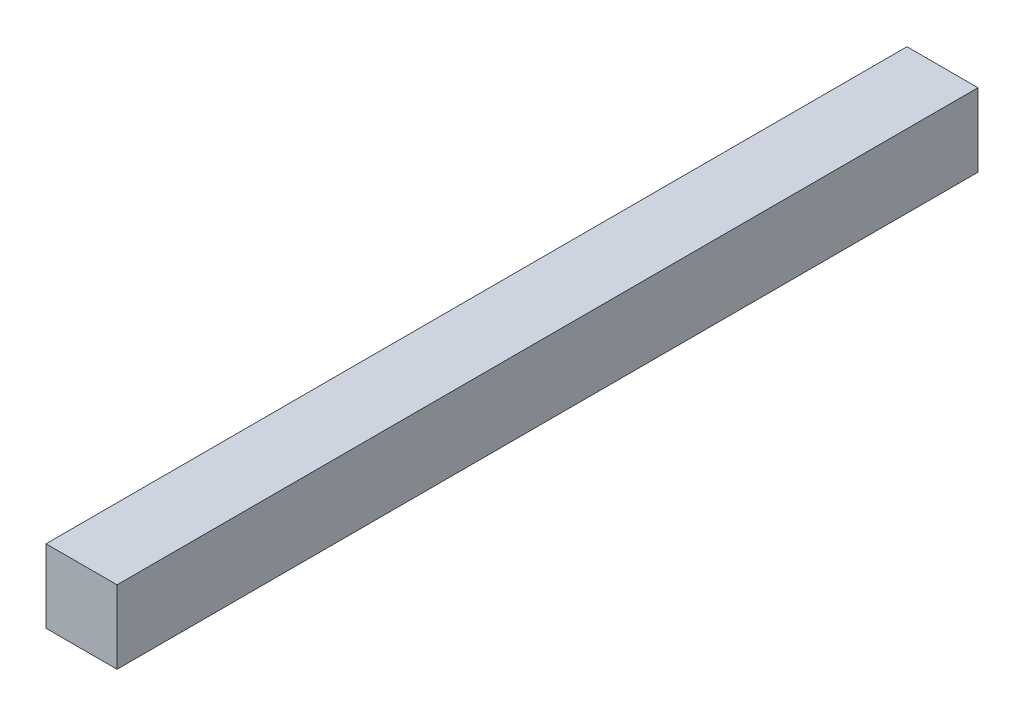
ISO-10303-21;
HEADER;
FILE_DESCRIPTION(('STEP AP214'),'2;1');
FILE_NAME('part.step','',(''),(''),'','','');
FILE_SCHEMA(('AUTOMOTIVE_DESIGN { 1 0 10303 214 1 1 1 1 }'));
ENDSEC;
DATA;
#1=APPLICATION_CONTEXT('core data for automotive mechanical design processes');
#2=APPLICATION_PROTOCOL_DEFINITION('international standard','automotive_design',2000,#1);
#3=PRODUCT_CONTEXT('',#1,'mechanical');
#4=PRODUCT('Part','Part','',(#3));
#5=PRODUCT_RELATED_PRODUCT_CATEGORY('part','',(#4));
#6=PRODUCT_DEFINITION_FORMATION('','',#4);
#7=PRODUCT_DEFINITION_CONTEXT('part definition',#1,'design');
#8=PRODUCT_DEFINITION('design','',#6,#7);
#9=PRODUCT_DEFINITION_SHAPE('','',#8);
#10=(LENGTH_UNIT() NAMED_UNIT(*) SI_UNIT(.MILLI.,.METRE.));
#11=(NAMED_UNIT(*) PLANE_ANGLE_UNIT() SI_UNIT($,.RADIAN.));
#12=(NAMED_UNIT(*) SI_UNIT($,.STERADIAN.) SOLID_ANGLE_UNIT());
#13=UNCERTAINTY_MEASURE_WITH_UNIT(LENGTH_MEASURE(1.E-05),#10,'distance_accuracy_value','');
#14=(GEOMETRIC_REPRESENTATION_CONTEXT(3) GLOBAL_UNCERTAINTY_ASSIGNED_CONTEXT((#13)) GLOBAL_UNIT_ASSIGNED_CONTEXT((#10,
#11,#12)) REPRESENTATION_CONTEXT('',''));
#15=CARTESIAN_POINT('',(0.,0.,0.));
#16=DIRECTION('',(0.,0.,1.));
#17=DIRECTION('',(1.,0.,0.));
#18=AXIS2_PLACEMENT_3D('',#15,#16,#17);
#19=CARTESIAN_POINT('',(0.,0.,304.8));
#20=DIRECTION('',(1.,0.,0.));
#21=DIRECTION('',(0.,0.,-1.));
#22=AXIS2_PLACEMENT_3D('',#19,#20,#21);
#23=PLANE('',#22);
#24=DIRECTION('',(0.,-1.,0.));
#25=VECTOR('',#24,1.);
#26=CARTESIAN_POINT('',(0.,0.,0.));
#27=LINE('',#26,#25);
#28=CARTESIAN_POINT('',(0.,25.908,0.));
#29=VERTEX_POINT('',#28);
#30=CARTESIAN_POINT('',(0.,0.,0.));
#31=VERTEX_POINT('',#30);
#32=EDGE_CURVE('E93',#29,#31,#27,.T.);
#33=ORIENTED_EDGE('',*,*,#32,.T.);
#34=DIRECTION('',(0.,0.,-1.));
#35=VECTOR('',#34,1.);
#36=CARTESIAN_POINT('',(0.,0.,304.8));
#37=LINE('',#36,#35);
#38=CARTESIAN_POINT('',(0.,0.,304.8));
#39=VERTEX_POINT('',#38);
#40=EDGE_CURVE('E11',#39,#31,#37,.T.);
#41=ORIENTED_EDGE('',*,*,#40,.F.);
#42=DIRECTION('',(0.,-1.,0.));
#43=VECTOR('',#42,1.);
#44=CARTESIAN_POINT('',(0.,0.,304.8));
#45=LINE('',#44,#43);
#46=CARTESIAN_POINT('',(0.,25.908,304.8));
#47=VERTEX_POINT('',#46);
#48=EDGE_CURVE('E81',#47,#39,#45,.T.);
#49=ORIENTED_EDGE('',*,*,#48,.F.);
#50=DIRECTION('',(0.,0.,-1.));
#51=VECTOR('',#50,1.);
#52=CARTESIAN_POINT('',(0.,25.908,304.8));
#53=LINE('',#52,#51);
#54=EDGE_CURVE('E89',#47,#29,#53,.T.);
#55=ORIENTED_EDGE('',*,*,#54,.T.);
#56=EDGE_LOOP('',(#33,#41,#49,#55));
#57=FACE_BOUND('',#56,.T.);
#58=ADVANCED_FACE('F30',(#57),#23,.F.);
#59=CARTESIAN_POINT('',(0.,0.,304.8));
#60=DIRECTION('',(0.,1.,0.));
#61=DIRECTION('',(0.,0.,1.));
#62=AXIS2_PLACEMENT_3D('',#59,#60,#61);
#63=PLANE('',#62);
#64=DIRECTION('',(1.,0.,0.));
#65=VECTOR('',#64,1.);
#66=CARTESIAN_POINT('',(0.,0.,0.));
#67=LINE('',#66,#65);
#68=CARTESIAN_POINT('',(25.146,0.,0.));
#69=VERTEX_POINT('',#68);
#70=EDGE_CURVE('E85',#31,#69,#67,.T.);
#71=ORIENTED_EDGE('',*,*,#70,.T.);
#72=DIRECTION('',(0.,0.,-1.));
#73=VECTOR('',#72,1.);
#74=CARTESIAN_POINT('',(25.146,0.,304.8));
#75=LINE('',#74,#73);
#76=CARTESIAN_POINT('',(25.146,0.,304.8));
#77=VERTEX_POINT('',#76);
#78=EDGE_CURVE('E38',#77,#69,#75,.T.);
#79=ORIENTED_EDGE('',*,*,#78,.F.);
#80=DIRECTION('',(1.,0.,0.));
#81=VECTOR('',#80,1.);
#82=CARTESIAN_POINT('',(0.,0.,304.8));
#83=LINE('',#82,#81);
#84=EDGE_CURVE('E76',#39,#77,#83,.T.);
#85=ORIENTED_EDGE('',*,*,#84,.F.);
#86=ORIENTED_EDGE('',*,*,#40,.T.);
#87=EDGE_LOOP('',(#71,#79,#85,#86));
#88=FACE_BOUND('',#87,.T.);
#89=ADVANCED_FACE('F84',(#88),#63,.F.);
#90=CARTESIAN_POINT('',(25.146,0.,304.8));
#91=DIRECTION('',(-1.,0.,0.));
#92=DIRECTION('',(0.,-1.,0.));
#93=AXIS2_PLACEMENT_3D('',#90,#91,#92);
#94=PLANE('',#93);
#95=DIRECTION('',(0.,1.,0.));
#96=VECTOR('',#95,1.);
#97=CARTESIAN_POINT('',(25.146,0.,0.));
#98=LINE('',#97,#96);
#99=CARTESIAN_POINT('',(25.146,25.908,0.));
#100=VERTEX_POINT('',#99);
#101=EDGE_CURVE('E63',#69,#100,#98,.T.);
#102=ORIENTED_EDGE('',*,*,#101,.T.);
#103=DIRECTION('',(0.,0.,-1.));
#104=VECTOR('',#103,1.);
#105=CARTESIAN_POINT('',(25.146,25.908,304.8));
#106=LINE('',#105,#104);
#107=CARTESIAN_POINT('',(25.146,25.908,304.8));
#108=VERTEX_POINT('',#107);
#109=EDGE_CURVE('E86',#108,#100,#106,.T.);
#110=ORIENTED_EDGE('',*,*,#109,.F.);
#111=DIRECTION('',(0.,1.,0.));
#112=VECTOR('',#111,1.);
#113=CARTESIAN_POINT('',(25.146,0.,304.8));
#114=LINE('',#113,#112);
#115=EDGE_CURVE('E79',#77,#108,#114,.T.);
#116=ORIENTED_EDGE('',*,*,#115,.F.);
#117=ORIENTED_EDGE('',*,*,#78,.T.);
#118=EDGE_LOOP('',(#102,#110,#116,#117));
#119=FACE_BOUND('',#118,.T.);
#120=ADVANCED_FACE('F87',(#119),#94,.F.);
#121=CARTESIAN_POINT('',(0.,25.908,304.8));
#122=DIRECTION('',(0.,-1.,0.));
#123=DIRECTION('',(0.,0.,-1.));
#124=AXIS2_PLACEMENT_3D('',#121,#122,#123);
#125=PLANE('',#124);
#126=DIRECTION('',(-1.,0.,0.));
#127=VECTOR('',#126,1.);
#128=CARTESIAN_POINT('',(0.,25.908,0.));
#129=LINE('',#128,#127);
#130=EDGE_CURVE('E69',#100,#29,#129,.T.);
#131=ORIENTED_EDGE('',*,*,#130,.T.);
#132=ORIENTED_EDGE('',*,*,#54,.F.);
#133=DIRECTION('',(-1.,0.,0.));
#134=VECTOR('',#133,1.);
#135=CARTESIAN_POINT('',(0.,25.908,304.8));
#136=LINE('',#135,#134);
#137=EDGE_CURVE('E46',#108,#47,#136,.T.);
#138=ORIENTED_EDGE('',*,*,#137,.F.);
#139=ORIENTED_EDGE('',*,*,#109,.T.);
#140=EDGE_LOOP('',(#131,#132,#138,#139));
#141=FACE_BOUND('',#140,.T.);
#142=ADVANCED_FACE('F100',(#141),#125,.F.);
#143=CARTESIAN_POINT('',(0.,0.,304.8));
#144=DIRECTION('',(0.,0.,-1.));
#145=DIRECTION('',(-1.,0.,0.));
#146=AXIS2_PLACEMENT_3D('',#143,#144,#145);
#147=PLANE('',#146);
#148=ORIENTED_EDGE('',*,*,#48,.T.);
#149=ORIENTED_EDGE('',*,*,#84,.T.);
#150=ORIENTED_EDGE('',*,*,#115,.T.);
#151=ORIENTED_EDGE('',*,*,#137,.T.);
#152=EDGE_LOOP('',(#148,#149,#150,#151));
#153=FACE_BOUND('',#152,.T.);
#154=ADVANCED_FACE('F77',(#153),#147,.F.);
#155=CARTESIAN_POINT('',(0.,0.,0.));
#156=DIRECTION('',(0.,0.,-1.));
#157=DIRECTION('',(-1.,0.,0.));
#158=AXIS2_PLACEMENT_3D('',#155,#156,#157);
#159=PLANE('',#158);
#160=ORIENTED_EDGE('',*,*,#32,.F.);
#161=ORIENTED_EDGE('',*,*,#130,.F.);
#162=ORIENTED_EDGE('',*,*,#101,.F.);
#163=ORIENTED_EDGE('',*,*,#70,.F.);
#164=EDGE_LOOP('',(#160,#161,#162,#163));
#165=FACE_BOUND('',#164,.T.);
#166=ADVANCED_FACE('F103',(#165),#159,.T.);
#167=CLOSED_SHELL('',(#58,#89,#120,#142,#154,#166));
#168=MANIFOLD_SOLID_BREP('B2',#167);
#169=ADVANCED_BREP_SHAPE_REPRESENTATION('',(#18,#168),#14);
#170=SHAPE_DEFINITION_REPRESENTATION(#9,#169);
ENDSEC;
END-ISO-10303-21;
